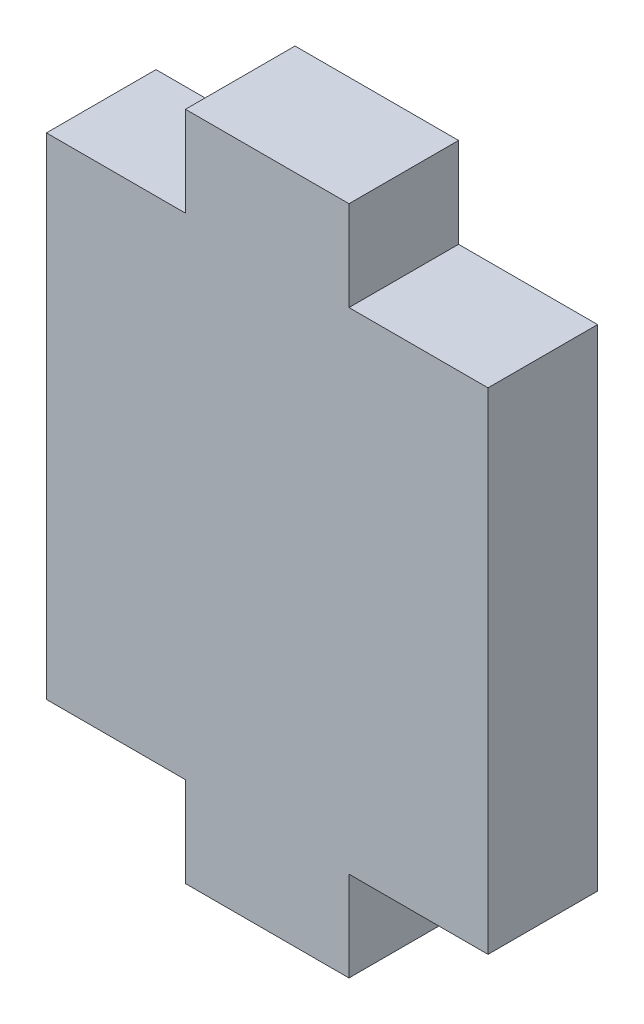
ISO-10303-21;
HEADER;
FILE_DESCRIPTION(('STEP AP214'),'2;1');
FILE_NAME('part.step','',(''),(''),'','','');
FILE_SCHEMA(('AUTOMOTIVE_DESIGN { 1 0 10303 214 1 1 1 1 }'));
ENDSEC;
DATA;
#1=APPLICATION_CONTEXT('core data for automotive mechanical design processes');
#2=APPLICATION_PROTOCOL_DEFINITION('international standard','automotive_design',2000,#1);
#3=PRODUCT_CONTEXT('',#1,'mechanical');
#4=PRODUCT('Part','Part','',(#3));
#5=PRODUCT_RELATED_PRODUCT_CATEGORY('part','',(#4));
#6=PRODUCT_DEFINITION_FORMATION('','',#4);
#7=PRODUCT_DEFINITION_CONTEXT('part definition',#1,'design');
#8=PRODUCT_DEFINITION('design','',#6,#7);
#9=PRODUCT_DEFINITION_SHAPE('','',#8);
#10=(LENGTH_UNIT() NAMED_UNIT(*) SI_UNIT(.MILLI.,.METRE.));
#11=(NAMED_UNIT(*) PLANE_ANGLE_UNIT() SI_UNIT($,.RADIAN.));
#12=(NAMED_UNIT(*) SI_UNIT($,.STERADIAN.) SOLID_ANGLE_UNIT());
#13=UNCERTAINTY_MEASURE_WITH_UNIT(LENGTH_MEASURE(1.E-05),#10,'distance_accuracy_value','');
#14=(GEOMETRIC_REPRESENTATION_CONTEXT(3) GLOBAL_UNCERTAINTY_ASSIGNED_CONTEXT((#13)) GLOBAL_UNIT_ASSIGNED_CONTEXT((#10,
#11,#12)) REPRESENTATION_CONTEXT('',''));
#15=CARTESIAN_POINT('',(0.,0.,0.));
#16=DIRECTION('',(0.,0.,1.));
#17=DIRECTION('',(1.,0.,0.));
#18=AXIS2_PLACEMENT_3D('',#15,#16,#17);
#19=CARTESIAN_POINT('',(5.,15.,6.7));
#20=DIRECTION('',(0.,-1.,0.));
#21=DIRECTION('',(1.,0.,0.));
#22=AXIS2_PLACEMENT_3D('',#19,#20,#21);
#23=PLANE('',#22);
#24=DIRECTION('',(-1.,0.,0.));
#25=VECTOR('',#24,1.);
#26=CARTESIAN_POINT('',(5.,15.,0.));
#27=LINE('',#26,#25);
#28=CARTESIAN_POINT('',(13.5,15.,0.));
#29=VERTEX_POINT('',#28);
#30=CARTESIAN_POINT('',(5.,15.,0.));
#31=VERTEX_POINT('',#30);
#32=EDGE_CURVE('E153',#29,#31,#27,.T.);
#33=ORIENTED_EDGE('',*,*,#32,.T.);
#34=DIRECTION('',(0.,0.,-1.));
#35=VECTOR('',#34,1.);
#36=CARTESIAN_POINT('',(5.,15.,6.7));
#37=LINE('',#36,#35);
#38=CARTESIAN_POINT('',(5.,15.,6.7));
#39=VERTEX_POINT('',#38);
#40=EDGE_CURVE('E11',#39,#31,#37,.T.);
#41=ORIENTED_EDGE('',*,*,#40,.F.);
#42=DIRECTION('',(-1.,0.,0.));
#43=VECTOR('',#42,1.);
#44=CARTESIAN_POINT('',(5.,15.,6.7));
#45=LINE('',#44,#43);
#46=CARTESIAN_POINT('',(13.5,15.,6.7));
#47=VERTEX_POINT('',#46);
#48=EDGE_CURVE('E175',#47,#39,#45,.T.);
#49=ORIENTED_EDGE('',*,*,#48,.F.);
#50=DIRECTION('',(0.,0.,-1.));
#51=VECTOR('',#50,1.);
#52=CARTESIAN_POINT('',(13.5,15.,6.7));
#53=LINE('',#52,#51);
#54=EDGE_CURVE('E149',#47,#29,#53,.T.);
#55=ORIENTED_EDGE('',*,*,#54,.T.);
#56=EDGE_LOOP('',(#33,#41,#49,#55));
#57=FACE_BOUND('',#56,.T.);
#58=ADVANCED_FACE('F33',(#57),#23,.F.);
#59=CARTESIAN_POINT('',(5.,15.,6.7));
#60=DIRECTION('',(-1.,0.,0.));
#61=DIRECTION('',(0.,0.,1.));
#62=AXIS2_PLACEMENT_3D('',#59,#60,#61);
#63=PLANE('',#62);
#64=DIRECTION('',(0.,1.,0.));
#65=VECTOR('',#64,1.);
#66=CARTESIAN_POINT('',(5.,15.,0.));
#67=LINE('',#66,#65);
#68=CARTESIAN_POINT('',(5.,20.5,0.));
#69=VERTEX_POINT('',#68);
#70=EDGE_CURVE('E156',#31,#69,#67,.T.);
#71=ORIENTED_EDGE('',*,*,#70,.T.);
#72=DIRECTION('',(0.,0.,-1.));
#73=VECTOR('',#72,1.);
#74=CARTESIAN_POINT('',(5.,20.5,6.7));
#75=LINE('',#74,#73);
#76=CARTESIAN_POINT('',(5.,20.5,6.7));
#77=VERTEX_POINT('',#76);
#78=EDGE_CURVE('E41',#77,#69,#75,.T.);
#79=ORIENTED_EDGE('',*,*,#78,.F.);
#80=DIRECTION('',(0.,1.,0.));
#81=VECTOR('',#80,1.);
#82=CARTESIAN_POINT('',(5.,15.,6.7));
#83=LINE('',#82,#81);
#84=EDGE_CURVE('E104',#39,#77,#83,.T.);
#85=ORIENTED_EDGE('',*,*,#84,.F.);
#86=ORIENTED_EDGE('',*,*,#40,.T.);
#87=EDGE_LOOP('',(#71,#79,#85,#86));
#88=FACE_BOUND('',#87,.T.);
#89=ADVANCED_FACE('F253',(#88),#63,.F.);
#90=CARTESIAN_POINT('',(5.,20.5,6.7));
#91=DIRECTION('',(0.,-1.,0.));
#92=DIRECTION('',(0.,0.,-1.));
#93=AXIS2_PLACEMENT_3D('',#90,#91,#92);
#94=PLANE('',#93);
#95=DIRECTION('',(-1.,0.,0.));
#96=VECTOR('',#95,1.);
#97=CARTESIAN_POINT('',(5.,20.5,0.));
#98=LINE('',#97,#96);
#99=CARTESIAN_POINT('',(-5.,20.5,0.));
#100=VERTEX_POINT('',#99);
#101=EDGE_CURVE('E158',#69,#100,#98,.T.);
#102=ORIENTED_EDGE('',*,*,#101,.T.);
#103=DIRECTION('',(0.,0.,-1.));
#104=VECTOR('',#103,1.);
#105=CARTESIAN_POINT('',(-5.,20.5,6.7));
#106=LINE('',#105,#104);
#107=CARTESIAN_POINT('',(-5.,20.5,6.7));
#108=VERTEX_POINT('',#107);
#109=EDGE_CURVE('E194',#108,#100,#106,.T.);
#110=ORIENTED_EDGE('',*,*,#109,.F.);
#111=DIRECTION('',(-1.,0.,0.));
#112=VECTOR('',#111,1.);
#113=CARTESIAN_POINT('',(5.,20.5,6.7));
#114=LINE('',#113,#112);
#115=EDGE_CURVE('E202',#77,#108,#114,.T.);
#116=ORIENTED_EDGE('',*,*,#115,.F.);
#117=ORIENTED_EDGE('',*,*,#78,.T.);
#118=EDGE_LOOP('',(#102,#110,#116,#117));
#119=FACE_BOUND('',#118,.T.);
#120=ADVANCED_FACE('F200',(#119),#94,.F.);
#121=CARTESIAN_POINT('',(-5.,15.,6.7));
#122=DIRECTION('',(1.,0.,0.));
#123=DIRECTION('',(0.,0.,-1.));
#124=AXIS2_PLACEMENT_3D('',#121,#122,#123);
#125=PLANE('',#124);
#126=DIRECTION('',(0.,-1.,0.));
#127=VECTOR('',#126,1.);
#128=CARTESIAN_POINT('',(-5.,15.,0.));
#129=LINE('',#128,#127);
#130=CARTESIAN_POINT('',(-5.,15.,0.));
#131=VERTEX_POINT('',#130);
#132=EDGE_CURVE('E160',#100,#131,#129,.T.);
#133=ORIENTED_EDGE('',*,*,#132,.T.);
#134=DIRECTION('',(0.,0.,-1.));
#135=VECTOR('',#134,1.);
#136=CARTESIAN_POINT('',(-5.,15.,6.7));
#137=LINE('',#136,#135);
#138=CARTESIAN_POINT('',(-5.,15.,6.7));
#139=VERTEX_POINT('',#138);
#140=EDGE_CURVE('E191',#139,#131,#137,.T.);
#141=ORIENTED_EDGE('',*,*,#140,.F.);
#142=DIRECTION('',(0.,-1.,0.));
#143=VECTOR('',#142,1.);
#144=CARTESIAN_POINT('',(-5.,15.,6.7));
#145=LINE('',#144,#143);
#146=EDGE_CURVE('E220',#108,#139,#145,.T.);
#147=ORIENTED_EDGE('',*,*,#146,.F.);
#148=ORIENTED_EDGE('',*,*,#109,.T.);
#149=EDGE_LOOP('',(#133,#141,#147,#148));
#150=FACE_BOUND('',#149,.T.);
#151=ADVANCED_FACE('F211',(#150),#125,.F.);
#152=CARTESIAN_POINT('',(-13.5,15.,6.7));
#153=DIRECTION('',(0.,-1.,0.));
#154=DIRECTION('',(0.,0.,-1.));
#155=AXIS2_PLACEMENT_3D('',#152,#153,#154);
#156=PLANE('',#155);
#157=DIRECTION('',(-1.,0.,0.));
#158=VECTOR('',#157,1.);
#159=CARTESIAN_POINT('',(-13.5,15.,0.));
#160=LINE('',#159,#158);
#161=CARTESIAN_POINT('',(-13.5,15.,0.));
#162=VERTEX_POINT('',#161);
#163=EDGE_CURVE('E162',#131,#162,#160,.T.);
#164=ORIENTED_EDGE('',*,*,#163,.T.);
#165=DIRECTION('',(0.,0.,-1.));
#166=VECTOR('',#165,1.);
#167=CARTESIAN_POINT('',(-13.5,15.,6.7));
#168=LINE('',#167,#166);
#169=CARTESIAN_POINT('',(-13.5,15.,6.7));
#170=VERTEX_POINT('',#169);
#171=EDGE_CURVE('E188',#170,#162,#168,.T.);
#172=ORIENTED_EDGE('',*,*,#171,.F.);
#173=DIRECTION('',(-1.,0.,0.));
#174=VECTOR('',#173,1.);
#175=CARTESIAN_POINT('',(-13.5,15.,6.7));
#176=LINE('',#175,#174);
#177=EDGE_CURVE('E217',#139,#170,#176,.T.);
#178=ORIENTED_EDGE('',*,*,#177,.F.);
#179=ORIENTED_EDGE('',*,*,#140,.T.);
#180=EDGE_LOOP('',(#164,#172,#178,#179));
#181=FACE_BOUND('',#180,.T.);
#182=ADVANCED_FACE('F215',(#181),#156,.F.);
#183=CARTESIAN_POINT('',(-13.5,-15.,6.7));
#184=DIRECTION('',(1.,0.,0.));
#185=DIRECTION('',(0.,0.,-1.));
#186=AXIS2_PLACEMENT_3D('',#183,#184,#185);
#187=PLANE('',#186);
#188=DIRECTION('',(0.,-1.,0.));
#189=VECTOR('',#188,1.);
#190=CARTESIAN_POINT('',(-13.5,-15.,0.));
#191=LINE('',#190,#189);
#192=CARTESIAN_POINT('',(-13.5,-15.,0.));
#193=VERTEX_POINT('',#192);
#194=EDGE_CURVE('E164',#162,#193,#191,.T.);
#195=ORIENTED_EDGE('',*,*,#194,.T.);
#196=DIRECTION('',(0.,0.,-1.));
#197=VECTOR('',#196,1.);
#198=CARTESIAN_POINT('',(-13.5,-15.,6.7));
#199=LINE('',#198,#197);
#200=CARTESIAN_POINT('',(-13.5,-15.,6.7));
#201=VERTEX_POINT('',#200);
#202=EDGE_CURVE('E185',#201,#193,#199,.T.);
#203=ORIENTED_EDGE('',*,*,#202,.F.);
#204=DIRECTION('',(0.,-1.,0.));
#205=VECTOR('',#204,1.);
#206=CARTESIAN_POINT('',(-13.5,-15.,6.7));
#207=LINE('',#206,#205);
#208=EDGE_CURVE('E219',#170,#201,#207,.T.);
#209=ORIENTED_EDGE('',*,*,#208,.F.);
#210=ORIENTED_EDGE('',*,*,#171,.T.);
#211=EDGE_LOOP('',(#195,#203,#209,#210));
#212=FACE_BOUND('',#211,.T.);
#213=ADVANCED_FACE('F266',(#212),#187,.F.);
#214=CARTESIAN_POINT('',(-13.5,-15.,6.7));
#215=DIRECTION('',(0.,1.,0.));
#216=DIRECTION('',(-1.,0.,0.));
#217=AXIS2_PLACEMENT_3D('',#214,#215,#216);
#218=PLANE('',#217);
#219=DIRECTION('',(1.,0.,0.));
#220=VECTOR('',#219,1.);
#221=CARTESIAN_POINT('',(-13.5,-15.,0.));
#222=LINE('',#221,#220);
#223=CARTESIAN_POINT('',(-5.,-15.,0.));
#224=VERTEX_POINT('',#223);
#225=EDGE_CURVE('E166',#193,#224,#222,.T.);
#226=ORIENTED_EDGE('',*,*,#225,.T.);
#227=DIRECTION('',(0.,0.,-1.));
#228=VECTOR('',#227,1.);
#229=CARTESIAN_POINT('',(-5.,-15.,6.7));
#230=LINE('',#229,#228);
#231=CARTESIAN_POINT('',(-5.,-15.,6.7));
#232=VERTEX_POINT('',#231);
#233=EDGE_CURVE('E182',#232,#224,#230,.T.);
#234=ORIENTED_EDGE('',*,*,#233,.F.);
#235=DIRECTION('',(1.,0.,0.));
#236=VECTOR('',#235,1.);
#237=CARTESIAN_POINT('',(-13.5,-15.,6.7));
#238=LINE('',#237,#236);
#239=EDGE_CURVE('E222',#201,#232,#238,.T.);
#240=ORIENTED_EDGE('',*,*,#239,.F.);
#241=ORIENTED_EDGE('',*,*,#202,.T.);
#242=EDGE_LOOP('',(#226,#234,#240,#241));
#243=FACE_BOUND('',#242,.T.);
#244=ADVANCED_FACE('F269',(#243),#218,.F.);
#245=CARTESIAN_POINT('',(-5.,-15.,6.7));
#246=DIRECTION('',(1.,0.,0.));
#247=DIRECTION('',(0.,1.,0.));
#248=AXIS2_PLACEMENT_3D('',#245,#246,#247);
#249=PLANE('',#248);
#250=DIRECTION('',(0.,-1.,0.));
#251=VECTOR('',#250,1.);
#252=CARTESIAN_POINT('',(-5.,-15.,0.));
#253=LINE('',#252,#251);
#254=CARTESIAN_POINT('',(-5.,-20.5,0.));
#255=VERTEX_POINT('',#254);
#256=EDGE_CURVE('E168',#224,#255,#253,.T.);
#257=ORIENTED_EDGE('',*,*,#256,.T.);
#258=DIRECTION('',(0.,0.,-1.));
#259=VECTOR('',#258,1.);
#260=CARTESIAN_POINT('',(-5.,-20.5,6.7));
#261=LINE('',#260,#259);
#262=CARTESIAN_POINT('',(-5.,-20.5,6.7));
#263=VERTEX_POINT('',#262);
#264=EDGE_CURVE('E179',#263,#255,#261,.T.);
#265=ORIENTED_EDGE('',*,*,#264,.F.);
#266=DIRECTION('',(0.,-1.,0.));
#267=VECTOR('',#266,1.);
#268=CARTESIAN_POINT('',(-5.,-15.,6.7));
#269=LINE('',#268,#267);
#270=EDGE_CURVE('E228',#232,#263,#269,.T.);
#271=ORIENTED_EDGE('',*,*,#270,.F.);
#272=ORIENTED_EDGE('',*,*,#233,.T.);
#273=EDGE_LOOP('',(#257,#265,#271,#272));
#274=FACE_BOUND('',#273,.T.);
#275=ADVANCED_FACE('F234',(#274),#249,.F.);
#276=CARTESIAN_POINT('',(5.,-20.5,6.7));
#277=DIRECTION('',(0.,1.,0.));
#278=DIRECTION('',(0.,0.,1.));
#279=AXIS2_PLACEMENT_3D('',#276,#277,#278);
#280=PLANE('',#279);
#281=DIRECTION('',(1.,0.,0.));
#282=VECTOR('',#281,1.);
#283=CARTESIAN_POINT('',(5.,-20.5,0.));
#284=LINE('',#283,#282);
#285=CARTESIAN_POINT('',(5.,-20.5,0.));
#286=VERTEX_POINT('',#285);
#287=EDGE_CURVE('E170',#255,#286,#284,.T.);
#288=ORIENTED_EDGE('',*,*,#287,.T.);
#289=DIRECTION('',(0.,0.,-1.));
#290=VECTOR('',#289,1.);
#291=CARTESIAN_POINT('',(5.,-20.5,6.7));
#292=LINE('',#291,#290);
#293=CARTESIAN_POINT('',(5.,-20.5,6.7));
#294=VERTEX_POINT('',#293);
#295=EDGE_CURVE('E144',#294,#286,#292,.T.);
#296=ORIENTED_EDGE('',*,*,#295,.F.);
#297=DIRECTION('',(1.,0.,0.));
#298=VECTOR('',#297,1.);
#299=CARTESIAN_POINT('',(5.,-20.5,6.7));
#300=LINE('',#299,#298);
#301=EDGE_CURVE('E135',#263,#294,#300,.T.);
#302=ORIENTED_EDGE('',*,*,#301,.F.);
#303=ORIENTED_EDGE('',*,*,#264,.T.);
#304=EDGE_LOOP('',(#288,#296,#302,#303));
#305=FACE_BOUND('',#304,.T.);
#306=ADVANCED_FACE('F238',(#305),#280,.F.);
#307=CARTESIAN_POINT('',(5.,-15.,6.7));
#308=DIRECTION('',(-1.,0.,0.));
#309=DIRECTION('',(0.,-1.,0.));
#310=AXIS2_PLACEMENT_3D('',#307,#308,#309);
#311=PLANE('',#310);
#312=DIRECTION('',(0.,1.,0.));
#313=VECTOR('',#312,1.);
#314=CARTESIAN_POINT('',(5.,-15.,0.));
#315=LINE('',#314,#313);
#316=CARTESIAN_POINT('',(5.,-15.,0.));
#317=VERTEX_POINT('',#316);
#318=EDGE_CURVE('E143',#286,#317,#315,.T.);
#319=ORIENTED_EDGE('',*,*,#318,.T.);
#320=DIRECTION('',(0.,0.,-1.));
#321=VECTOR('',#320,1.);
#322=CARTESIAN_POINT('',(5.,-15.,6.7));
#323=LINE('',#322,#321);
#324=CARTESIAN_POINT('',(5.,-15.,6.7));
#325=VERTEX_POINT('',#324);
#326=EDGE_CURVE('E140',#325,#317,#323,.T.);
#327=ORIENTED_EDGE('',*,*,#326,.F.);
#328=DIRECTION('',(0.,1.,0.));
#329=VECTOR('',#328,1.);
#330=CARTESIAN_POINT('',(5.,-15.,6.7));
#331=LINE('',#330,#329);
#332=EDGE_CURVE('E129',#294,#325,#331,.T.);
#333=ORIENTED_EDGE('',*,*,#332,.F.);
#334=ORIENTED_EDGE('',*,*,#295,.T.);
#335=EDGE_LOOP('',(#319,#327,#333,#334));
#336=FACE_BOUND('',#335,.T.);
#337=ADVANCED_FACE('F141',(#336),#311,.F.);
#338=CARTESIAN_POINT('',(5.,-15.,6.7));
#339=DIRECTION('',(0.,1.,0.));
#340=DIRECTION('',(-1.,0.,0.));
#341=AXIS2_PLACEMENT_3D('',#338,#339,#340);
#342=PLANE('',#341);
#343=DIRECTION('',(1.,0.,0.));
#344=VECTOR('',#343,1.);
#345=CARTESIAN_POINT('',(5.,-15.,0.));
#346=LINE('',#345,#344);
#347=CARTESIAN_POINT('',(13.5,-15.,0.));
#348=VERTEX_POINT('',#347);
#349=EDGE_CURVE('E90',#317,#348,#346,.T.);
#350=ORIENTED_EDGE('',*,*,#349,.T.);
#351=DIRECTION('',(0.,0.,-1.));
#352=VECTOR('',#351,1.);
#353=CARTESIAN_POINT('',(13.5,-15.,6.7));
#354=LINE('',#353,#352);
#355=CARTESIAN_POINT('',(13.5,-15.,6.7));
#356=VERTEX_POINT('',#355);
#357=EDGE_CURVE('E145',#356,#348,#354,.T.);
#358=ORIENTED_EDGE('',*,*,#357,.F.);
#359=DIRECTION('',(1.,0.,0.));
#360=VECTOR('',#359,1.);
#361=CARTESIAN_POINT('',(5.,-15.,6.7));
#362=LINE('',#361,#360);
#363=EDGE_CURVE('E133',#325,#356,#362,.T.);
#364=ORIENTED_EDGE('',*,*,#363,.F.);
#365=ORIENTED_EDGE('',*,*,#326,.T.);
#366=EDGE_LOOP('',(#350,#358,#364,#365));
#367=FACE_BOUND('',#366,.T.);
#368=ADVANCED_FACE('F147',(#367),#342,.F.);
#369=CARTESIAN_POINT('',(13.5,-15.,6.7));
#370=DIRECTION('',(-1.,0.,0.));
#371=DIRECTION('',(0.,0.,1.));
#372=AXIS2_PLACEMENT_3D('',#369,#370,#371);
#373=PLANE('',#372);
#374=DIRECTION('',(0.,1.,0.));
#375=VECTOR('',#374,1.);
#376=CARTESIAN_POINT('',(13.5,-15.,0.));
#377=LINE('',#376,#375);
#378=EDGE_CURVE('E96',#348,#29,#377,.T.);
#379=ORIENTED_EDGE('',*,*,#378,.T.);
#380=ORIENTED_EDGE('',*,*,#54,.F.);
#381=DIRECTION('',(0.,1.,0.));
#382=VECTOR('',#381,1.);
#383=CARTESIAN_POINT('',(13.5,-15.,6.7));
#384=LINE('',#383,#382);
#385=EDGE_CURVE('E49',#356,#47,#384,.T.);
#386=ORIENTED_EDGE('',*,*,#385,.F.);
#387=ORIENTED_EDGE('',*,*,#357,.T.);
#388=EDGE_LOOP('',(#379,#380,#386,#387));
#389=FACE_BOUND('',#388,.T.);
#390=ADVANCED_FACE('F242',(#389),#373,.F.);
#391=CARTESIAN_POINT('',(0.,0.,6.7));
#392=DIRECTION('',(0.,0.,1.));
#393=DIRECTION('',(1.,0.,0.));
#394=AXIS2_PLACEMENT_3D('',#391,#392,#393);
#395=PLANE('',#394);
#396=ORIENTED_EDGE('',*,*,#48,.T.);
#397=ORIENTED_EDGE('',*,*,#84,.T.);
#398=ORIENTED_EDGE('',*,*,#115,.T.);
#399=ORIENTED_EDGE('',*,*,#146,.T.);
#400=ORIENTED_EDGE('',*,*,#177,.T.);
#401=ORIENTED_EDGE('',*,*,#208,.T.);
#402=ORIENTED_EDGE('',*,*,#239,.T.);
#403=ORIENTED_EDGE('',*,*,#270,.T.);
#404=ORIENTED_EDGE('',*,*,#301,.T.);
#405=ORIENTED_EDGE('',*,*,#332,.T.);
#406=ORIENTED_EDGE('',*,*,#363,.T.);
#407=ORIENTED_EDGE('',*,*,#385,.T.);
#408=EDGE_LOOP('',(#396,#397,#398,#399,#400,#401,#402,#403,#404,#405,#406,#407));
#409=FACE_BOUND('',#408,.T.);
#410=ADVANCED_FACE('F131',(#409),#395,.T.);
#411=CARTESIAN_POINT('',(0.,0.,0.));
#412=DIRECTION('',(0.,0.,1.));
#413=DIRECTION('',(1.,0.,0.));
#414=AXIS2_PLACEMENT_3D('',#411,#412,#413);
#415=PLANE('',#414);
#416=ORIENTED_EDGE('',*,*,#32,.F.);
#417=ORIENTED_EDGE('',*,*,#378,.F.);
#418=ORIENTED_EDGE('',*,*,#349,.F.);
#419=ORIENTED_EDGE('',*,*,#318,.F.);
#420=ORIENTED_EDGE('',*,*,#287,.F.);
#421=ORIENTED_EDGE('',*,*,#256,.F.);
#422=ORIENTED_EDGE('',*,*,#225,.F.);
#423=ORIENTED_EDGE('',*,*,#194,.F.);
#424=ORIENTED_EDGE('',*,*,#163,.F.);
#425=ORIENTED_EDGE('',*,*,#132,.F.);
#426=ORIENTED_EDGE('',*,*,#101,.F.);
#427=ORIENTED_EDGE('',*,*,#70,.F.);
#428=EDGE_LOOP('',(#416,#417,#418,#419,#420,#421,#422,#423,#424,#425,#426,#427));
#429=FACE_BOUND('',#428,.T.);
#430=ADVANCED_FACE('F206',(#429),#415,.F.);
#431=CLOSED_SHELL('',(#58,#89,#120,#151,#182,#213,#244,#275,#306,#337,#368,#390,#410,#430));
#432=MANIFOLD_SOLID_BREP('B2',#431);
#433=ADVANCED_BREP_SHAPE_REPRESENTATION('',(#18,#432),#14);
#434=SHAPE_DEFINITION_REPRESENTATION(#9,#433);
ENDSEC;
END-ISO-10303-21;
